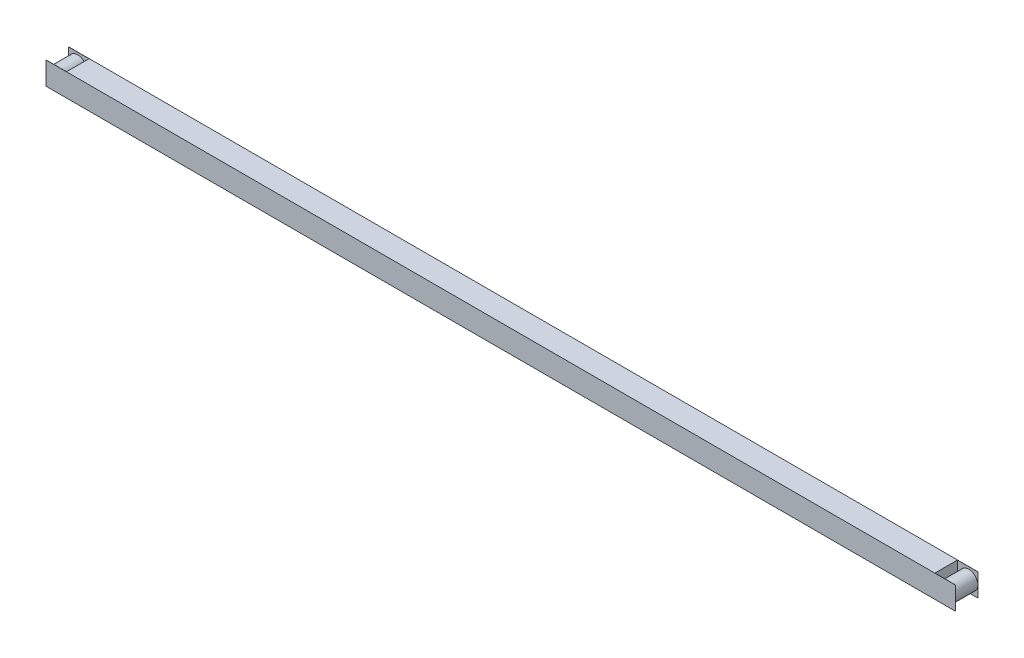
ISO-10303-21;
HEADER;
FILE_DESCRIPTION(('STEP AP214'),'2;1');
FILE_NAME('part.step','',(''),(''),'','','');
FILE_SCHEMA(('AUTOMOTIVE_DESIGN { 1 0 10303 214 1 1 1 1 }'));
ENDSEC;
DATA;
#1=APPLICATION_CONTEXT('core data for automotive mechanical design processes');
#2=APPLICATION_PROTOCOL_DEFINITION('international standard','automotive_design',2000,#1);
#3=PRODUCT_CONTEXT('',#1,'mechanical');
#4=PRODUCT('Part','Part','',(#3));
#5=PRODUCT_RELATED_PRODUCT_CATEGORY('part','',(#4));
#6=PRODUCT_DEFINITION_FORMATION('','',#4);
#7=PRODUCT_DEFINITION_CONTEXT('part definition',#1,'design');
#8=PRODUCT_DEFINITION('design','',#6,#7);
#9=PRODUCT_DEFINITION_SHAPE('','',#8);
#10=(LENGTH_UNIT() NAMED_UNIT(*) SI_UNIT(.MILLI.,.METRE.));
#11=(NAMED_UNIT(*) PLANE_ANGLE_UNIT() SI_UNIT($,.RADIAN.));
#12=(NAMED_UNIT(*) SI_UNIT($,.STERADIAN.) SOLID_ANGLE_UNIT());
#13=UNCERTAINTY_MEASURE_WITH_UNIT(LENGTH_MEASURE(1.E-05),#10,'distance_accuracy_value','');
#14=(GEOMETRIC_REPRESENTATION_CONTEXT(3) GLOBAL_UNCERTAINTY_ASSIGNED_CONTEXT((#13)) GLOBAL_UNIT_ASSIGNED_CONTEXT((#10,
#11,#12)) REPRESENTATION_CONTEXT('',''));
#15=CARTESIAN_POINT('',(0.,0.,0.));
#16=DIRECTION('',(0.,0.,1.));
#17=DIRECTION('',(1.,0.,0.));
#18=AXIS2_PLACEMENT_3D('',#15,#16,#17);
#19=CARTESIAN_POINT('',(0.,5.,5.));
#20=DIRECTION('',(1.,0.,0.));
#21=DIRECTION('',(0.,0.,-1.));
#22=AXIS2_PLACEMENT_3D('',#19,#20,#21);
#23=PLANE('',#22);
#24=DIRECTION('',(0.,-1.,0.));
#25=VECTOR('',#24,1.);
#26=CARTESIAN_POINT('',(0.,5.,0.0250000000000007));
#27=LINE('',#26,#25);
#28=CARTESIAN_POINT('',(0.,5.,0.0250000000000007));
#29=VERTEX_POINT('',#28);
#30=CARTESIAN_POINT('',(0.,2.5,0.0250000000000007));
#31=VERTEX_POINT('',#30);
#32=EDGE_CURVE('E269',#29,#31,#27,.T.);
#33=ORIENTED_EDGE('',*,*,#32,.F.);
#34=DIRECTION('',(0.,0.,-1.));
#35=VECTOR('',#34,1.);
#36=CARTESIAN_POINT('',(0.,5.,5.));
#37=LINE('',#36,#35);
#38=CARTESIAN_POINT('',(0.,5.,0.));
#39=VERTEX_POINT('',#38);
#40=EDGE_CURVE('E182',#29,#39,#37,.T.);
#41=ORIENTED_EDGE('',*,*,#40,.T.);
#42=DIRECTION('',(0.,-1.,0.));
#43=VECTOR('',#42,1.);
#44=CARTESIAN_POINT('',(0.,5.,0.));
#45=LINE('',#44,#43);
#46=CARTESIAN_POINT('',(0.,0.,0.));
#47=VERTEX_POINT('',#46);
#48=EDGE_CURVE('E183',#39,#47,#45,.T.);
#49=ORIENTED_EDGE('',*,*,#48,.T.);
#50=DIRECTION('',(0.,0.,-1.));
#51=VECTOR('',#50,1.);
#52=CARTESIAN_POINT('',(0.,0.,5.));
#53=LINE('',#52,#51);
#54=CARTESIAN_POINT('',(0.,0.,0.0250000000000007));
#55=VERTEX_POINT('',#54);
#56=EDGE_CURVE('E49',#55,#47,#53,.T.);
#57=ORIENTED_EDGE('',*,*,#56,.F.);
#58=EDGE_CURVE('E256',#31,#55,#27,.T.);
#59=ORIENTED_EDGE('',*,*,#58,.F.);
#60=EDGE_LOOP('',(#33,#41,#49,#57,#59));
#61=FACE_BOUND('',#60,.T.);
#62=ADVANCED_FACE('F41',(#61),#23,.F.);
#63=CARTESIAN_POINT('',(0.,0.,5.));
#64=DIRECTION('',(0.,1.,0.));
#65=DIRECTION('',(0.,0.,1.));
#66=AXIS2_PLACEMENT_3D('',#63,#64,#65);
#67=PLANE('',#66);
#68=DIRECTION('',(1.,0.,0.));
#69=VECTOR('',#68,1.);
#70=CARTESIAN_POINT('',(0.,0.,0.0250000000000007));
#71=LINE('',#70,#69);
#72=CARTESIAN_POINT('',(4.5,0.,0.0250000000000007));
#73=VERTEX_POINT('',#72);
#74=EDGE_CURVE('E267',#55,#73,#71,.T.);
#75=ORIENTED_EDGE('',*,*,#74,.F.);
#76=ORIENTED_EDGE('',*,*,#56,.T.);
#77=DIRECTION('',(1.,0.,0.));
#78=VECTOR('',#77,1.);
#79=CARTESIAN_POINT('',(0.,0.,0.));
#80=LINE('',#79,#78);
#81=CARTESIAN_POINT('',(200.,0.,0.));
#82=VERTEX_POINT('',#81);
#83=EDGE_CURVE('E186',#47,#82,#80,.T.);
#84=ORIENTED_EDGE('',*,*,#83,.T.);
#85=DIRECTION('',(0.,0.,-1.));
#86=VECTOR('',#85,1.);
#87=CARTESIAN_POINT('',(200.,0.,5.));
#88=LINE('',#87,#86);
#89=CARTESIAN_POINT('',(200.,0.,0.0250000000000007));
#90=VERTEX_POINT('',#89);
#91=EDGE_CURVE('E199',#90,#82,#88,.T.);
#92=ORIENTED_EDGE('',*,*,#91,.F.);
#93=DIRECTION('',(1.,0.,0.));
#94=VECTOR('',#93,1.);
#95=CARTESIAN_POINT('',(200.,0.,0.0250000000000007));
#96=LINE('',#95,#94);
#97=CARTESIAN_POINT('',(195.5,0.,0.0250000000000007));
#98=VERTEX_POINT('',#97);
#99=EDGE_CURVE('E147',#98,#90,#96,.T.);
#100=ORIENTED_EDGE('',*,*,#99,.F.);
#101=DIRECTION('',(0.,0.,1.));
#102=VECTOR('',#101,1.);
#103=CARTESIAN_POINT('',(195.5,0.,0.0250000000000007));
#104=LINE('',#103,#102);
#105=CARTESIAN_POINT('',(195.5,0.,4.975));
#106=VERTEX_POINT('',#105);
#107=EDGE_CURVE('E160',#98,#106,#104,.T.);
#108=ORIENTED_EDGE('',*,*,#107,.T.);
#109=DIRECTION('',(1.,0.,0.));
#110=VECTOR('',#109,1.);
#111=CARTESIAN_POINT('',(200.,0.,4.975));
#112=LINE('',#111,#110);
#113=CARTESIAN_POINT('',(200.,0.,4.975));
#114=VERTEX_POINT('',#113);
#115=EDGE_CURVE('E225',#106,#114,#112,.T.);
#116=ORIENTED_EDGE('',*,*,#115,.T.);
#117=CARTESIAN_POINT('',(200.,0.,5.));
#118=VERTEX_POINT('',#117);
#119=EDGE_CURVE('E200',#118,#114,#88,.T.);
#120=ORIENTED_EDGE('',*,*,#119,.F.);
#121=DIRECTION('',(1.,0.,0.));
#122=VECTOR('',#121,1.);
#123=CARTESIAN_POINT('',(0.,0.,5.));
#124=LINE('',#123,#122);
#125=CARTESIAN_POINT('',(0.,0.,5.));
#126=VERTEX_POINT('',#125);
#127=EDGE_CURVE('E175',#126,#118,#124,.T.);
#128=ORIENTED_EDGE('',*,*,#127,.F.);
#129=CARTESIAN_POINT('',(0.,0.,4.975));
#130=VERTEX_POINT('',#129);
#131=EDGE_CURVE('E11',#126,#130,#53,.T.);
#132=ORIENTED_EDGE('',*,*,#131,.T.);
#133=DIRECTION('',(1.,0.,0.));
#134=VECTOR('',#133,1.);
#135=CARTESIAN_POINT('',(0.,0.,4.975));
#136=LINE('',#135,#134);
#137=CARTESIAN_POINT('',(4.5,0.,4.975));
#138=VERTEX_POINT('',#137);
#139=EDGE_CURVE('E244',#130,#138,#136,.T.);
#140=ORIENTED_EDGE('',*,*,#139,.T.);
#141=DIRECTION('',(0.,0.,1.));
#142=VECTOR('',#141,1.);
#143=CARTESIAN_POINT('',(4.5,0.,0.0250000000000007));
#144=LINE('',#143,#142);
#145=EDGE_CURVE('E258',#73,#138,#144,.T.);
#146=ORIENTED_EDGE('',*,*,#145,.F.);
#147=EDGE_LOOP('',(#75,#76,#84,#92,#100,#108,#116,#120,#128,#132,#140,#146));
#148=FACE_BOUND('',#147,.T.);
#149=ADVANCED_FACE('F211',(#148),#67,.F.);
#150=CARTESIAN_POINT('',(200.,0.,5.));
#151=DIRECTION('',(-1.,0.,0.));
#152=DIRECTION('',(0.,0.,1.));
#153=AXIS2_PLACEMENT_3D('',#150,#151,#152);
#154=PLANE('',#153);
#155=DIRECTION('',(0.,1.,0.));
#156=VECTOR('',#155,1.);
#157=CARTESIAN_POINT('',(200.,5.,4.975));
#158=LINE('',#157,#156);
#159=CARTESIAN_POINT('',(200.,2.5,4.975));
#160=VERTEX_POINT('',#159);
#161=EDGE_CURVE('E233',#114,#160,#158,.T.);
#162=ORIENTED_EDGE('',*,*,#161,.T.);
#163=CARTESIAN_POINT('',(200.,5.,4.975));
#164=VERTEX_POINT('',#163);
#165=EDGE_CURVE('E171',#160,#164,#158,.T.);
#166=ORIENTED_EDGE('',*,*,#165,.T.);
#167=DIRECTION('',(0.,0.,-1.));
#168=VECTOR('',#167,1.);
#169=CARTESIAN_POINT('',(200.,5.,5.));
#170=LINE('',#169,#168);
#171=CARTESIAN_POINT('',(200.,5.,5.));
#172=VERTEX_POINT('',#171);
#173=EDGE_CURVE('E197',#172,#164,#170,.T.);
#174=ORIENTED_EDGE('',*,*,#173,.F.);
#175=DIRECTION('',(0.,1.,0.));
#176=VECTOR('',#175,1.);
#177=CARTESIAN_POINT('',(200.,0.,5.));
#178=LINE('',#177,#176);
#179=EDGE_CURVE('E178',#118,#172,#178,.T.);
#180=ORIENTED_EDGE('',*,*,#179,.F.);
#181=ORIENTED_EDGE('',*,*,#119,.T.);
#182=EDGE_LOOP('',(#162,#166,#174,#180,#181));
#183=FACE_BOUND('',#182,.T.);
#184=ADVANCED_FACE('F279',(#183),#154,.F.);
#185=CARTESIAN_POINT('',(200.,5.,5.));
#186=DIRECTION('',(0.,-1.,0.));
#187=DIRECTION('',(1.,0.,0.));
#188=AXIS2_PLACEMENT_3D('',#185,#186,#187);
#189=PLANE('',#188);
#190=DIRECTION('',(-1.,0.,0.));
#191=VECTOR('',#190,1.);
#192=CARTESIAN_POINT('',(0.,5.,0.0250000000000007));
#193=LINE('',#192,#191);
#194=CARTESIAN_POINT('',(4.5,5.,0.0250000000000007));
#195=VERTEX_POINT('',#194);
#196=EDGE_CURVE('E247',#195,#29,#193,.T.);
#197=ORIENTED_EDGE('',*,*,#196,.F.);
#198=DIRECTION('',(0.,0.,1.));
#199=VECTOR('',#198,1.);
#200=CARTESIAN_POINT('',(4.5,5.,0.0250000000000007));
#201=LINE('',#200,#199);
#202=CARTESIAN_POINT('',(4.5,5.,4.975));
#203=VERTEX_POINT('',#202);
#204=EDGE_CURVE('E187',#195,#203,#201,.T.);
#205=ORIENTED_EDGE('',*,*,#204,.T.);
#206=DIRECTION('',(-1.,0.,0.));
#207=VECTOR('',#206,1.);
#208=CARTESIAN_POINT('',(0.,5.,4.975));
#209=LINE('',#208,#207);
#210=CARTESIAN_POINT('',(0.,5.,4.975));
#211=VERTEX_POINT('',#210);
#212=EDGE_CURVE('E253',#203,#211,#209,.T.);
#213=ORIENTED_EDGE('',*,*,#212,.T.);
#214=CARTESIAN_POINT('',(0.,5.,5.));
#215=VERTEX_POINT('',#214);
#216=EDGE_CURVE('E194',#215,#211,#37,.T.);
#217=ORIENTED_EDGE('',*,*,#216,.F.);
#218=DIRECTION('',(-1.,0.,0.));
#219=VECTOR('',#218,1.);
#220=CARTESIAN_POINT('',(200.,5.,5.));
#221=LINE('',#220,#219);
#222=EDGE_CURVE('E180',#172,#215,#221,.T.);
#223=ORIENTED_EDGE('',*,*,#222,.F.);
#224=ORIENTED_EDGE('',*,*,#173,.T.);
#225=DIRECTION('',(-1.,0.,0.));
#226=VECTOR('',#225,1.);
#227=CARTESIAN_POINT('',(195.5,5.,4.975));
#228=LINE('',#227,#226);
#229=CARTESIAN_POINT('',(195.5,5.,4.975));
#230=VERTEX_POINT('',#229);
#231=EDGE_CURVE('E164',#164,#230,#228,.T.);
#232=ORIENTED_EDGE('',*,*,#231,.T.);
#233=DIRECTION('',(0.,0.,1.));
#234=VECTOR('',#233,1.);
#235=CARTESIAN_POINT('',(195.5,5.,0.0250000000000007));
#236=LINE('',#235,#234);
#237=CARTESIAN_POINT('',(195.5,5.,0.0250000000000007));
#238=VERTEX_POINT('',#237);
#239=EDGE_CURVE('E158',#238,#230,#236,.T.);
#240=ORIENTED_EDGE('',*,*,#239,.F.);
#241=DIRECTION('',(-1.,0.,0.));
#242=VECTOR('',#241,1.);
#243=CARTESIAN_POINT('',(195.5,5.,0.0250000000000007));
#244=LINE('',#243,#242);
#245=CARTESIAN_POINT('',(200.,5.,0.0250000000000007));
#246=VERTEX_POINT('',#245);
#247=EDGE_CURVE('E169',#246,#238,#244,.T.);
#248=ORIENTED_EDGE('',*,*,#247,.F.);
#249=CARTESIAN_POINT('',(200.,5.,0.));
#250=VERTEX_POINT('',#249);
#251=EDGE_CURVE('E155',#246,#250,#170,.T.);
#252=ORIENTED_EDGE('',*,*,#251,.T.);
#253=DIRECTION('',(-1.,0.,0.));
#254=VECTOR('',#253,1.);
#255=CARTESIAN_POINT('',(200.,5.,0.));
#256=LINE('',#255,#254);
#257=EDGE_CURVE('E176',#250,#39,#256,.T.);
#258=ORIENTED_EDGE('',*,*,#257,.T.);
#259=ORIENTED_EDGE('',*,*,#40,.F.);
#260=EDGE_LOOP('',(#197,#205,#213,#217,#223,#224,#232,#240,#248,#252,#258,#259));
#261=FACE_BOUND('',#260,.T.);
#262=ADVANCED_FACE('F219',(#261),#189,.F.);
#263=ORIENTED_EDGE('',*,*,#216,.T.);
#264=DIRECTION('',(0.,-1.,0.));
#265=VECTOR('',#264,1.);
#266=CARTESIAN_POINT('',(0.,5.,4.975));
#267=LINE('',#266,#265);
#268=CARTESIAN_POINT('',(0.,2.5,4.975));
#269=VERTEX_POINT('',#268);
#270=EDGE_CURVE('E238',#211,#269,#267,.T.);
#271=ORIENTED_EDGE('',*,*,#270,.T.);
#272=EDGE_CURVE('E236',#269,#130,#267,.T.);
#273=ORIENTED_EDGE('',*,*,#272,.T.);
#274=ORIENTED_EDGE('',*,*,#131,.F.);
#275=DIRECTION('',(0.,-1.,0.));
#276=VECTOR('',#275,1.);
#277=CARTESIAN_POINT('',(0.,5.,5.));
#278=LINE('',#277,#276);
#279=EDGE_CURVE('E172',#215,#126,#278,.T.);
#280=ORIENTED_EDGE('',*,*,#279,.F.);
#281=EDGE_LOOP('',(#263,#271,#273,#274,#280));
#282=FACE_BOUND('',#281,.T.);
#283=ADVANCED_FACE('F43',(#282),#23,.F.);
#284=ORIENTED_EDGE('',*,*,#251,.F.);
#285=DIRECTION('',(0.,1.,0.));
#286=VECTOR('',#285,1.);
#287=CARTESIAN_POINT('',(200.,5.,0.0250000000000007));
#288=LINE('',#287,#286);
#289=CARTESIAN_POINT('',(200.,2.5,0.0250000000000007));
#290=VERTEX_POINT('',#289);
#291=EDGE_CURVE('E150',#290,#246,#288,.T.);
#292=ORIENTED_EDGE('',*,*,#291,.F.);
#293=EDGE_CURVE('E140',#90,#290,#288,.T.);
#294=ORIENTED_EDGE('',*,*,#293,.F.);
#295=ORIENTED_EDGE('',*,*,#91,.T.);
#296=DIRECTION('',(0.,1.,0.));
#297=VECTOR('',#296,1.);
#298=CARTESIAN_POINT('',(200.,0.,0.));
#299=LINE('',#298,#297);
#300=EDGE_CURVE('E190',#82,#250,#299,.T.);
#301=ORIENTED_EDGE('',*,*,#300,.T.);
#302=EDGE_LOOP('',(#284,#292,#294,#295,#301));
#303=FACE_BOUND('',#302,.T.);
#304=ADVANCED_FACE('F153',(#303),#154,.F.);
#305=CARTESIAN_POINT('',(0.,0.,5.));
#306=DIRECTION('',(0.,0.,1.));
#307=DIRECTION('',(1.,0.,0.));
#308=AXIS2_PLACEMENT_3D('',#305,#306,#307);
#309=PLANE('',#308);
#310=ORIENTED_EDGE('',*,*,#279,.T.);
#311=ORIENTED_EDGE('',*,*,#127,.T.);
#312=ORIENTED_EDGE('',*,*,#179,.T.);
#313=ORIENTED_EDGE('',*,*,#222,.T.);
#314=EDGE_LOOP('',(#310,#311,#312,#313));
#315=FACE_BOUND('',#314,.T.);
#316=ADVANCED_FACE('F289',(#315),#309,.T.);
#317=CARTESIAN_POINT('',(0.,0.,0.));
#318=DIRECTION('',(0.,0.,1.));
#319=DIRECTION('',(1.,0.,0.));
#320=AXIS2_PLACEMENT_3D('',#317,#318,#319);
#321=PLANE('',#320);
#322=ORIENTED_EDGE('',*,*,#48,.F.);
#323=ORIENTED_EDGE('',*,*,#257,.F.);
#324=ORIENTED_EDGE('',*,*,#300,.F.);
#325=ORIENTED_EDGE('',*,*,#83,.F.);
#326=EDGE_LOOP('',(#322,#323,#324,#325));
#327=FACE_BOUND('',#326,.T.);
#328=ADVANCED_FACE('F215',(#327),#321,.F.);
#329=CARTESIAN_POINT('',(195.5,0.,0.0250000000000007));
#330=DIRECTION('',(-1.,0.,0.));
#331=DIRECTION('',(0.,0.,1.));
#332=AXIS2_PLACEMENT_3D('',#329,#330,#331);
#333=PLANE('',#332);
#334=DIRECTION('',(0.,-1.,0.));
#335=VECTOR('',#334,1.);
#336=CARTESIAN_POINT('',(195.5,0.,4.975));
#337=LINE('',#336,#335);
#338=EDGE_CURVE('E235',#230,#106,#337,.T.);
#339=ORIENTED_EDGE('',*,*,#338,.T.);
#340=ORIENTED_EDGE('',*,*,#107,.F.);
#341=DIRECTION('',(0.,-1.,0.));
#342=VECTOR('',#341,1.);
#343=CARTESIAN_POINT('',(195.5,0.,0.0250000000000007));
#344=LINE('',#343,#342);
#345=EDGE_CURVE('E167',#238,#98,#344,.T.);
#346=ORIENTED_EDGE('',*,*,#345,.F.);
#347=ORIENTED_EDGE('',*,*,#239,.T.);
#348=EDGE_LOOP('',(#339,#340,#346,#347));
#349=FACE_BOUND('',#348,.T.);
#350=ADVANCED_FACE('F321',(#349),#333,.F.);
#351=CARTESIAN_POINT('',(0.,0.,0.0250000000000007));
#352=DIRECTION('',(0.,0.,-1.));
#353=DIRECTION('',(-1.,0.,0.));
#354=AXIS2_PLACEMENT_3D('',#351,#352,#353);
#355=PLANE('',#354);
#356=ORIENTED_EDGE('',*,*,#293,.T.);
#357=CARTESIAN_POINT('',(198.,2.5,0.0250000000000007));
#358=DIRECTION('',(0.,0.,1.));
#359=DIRECTION('',(1.,0.,0.));
#360=AXIS2_PLACEMENT_3D('',#357,#358,#359);
#361=CIRCLE('',#360,2.);
#362=EDGE_CURVE('E144',#290,#290,#361,.T.);
#363=ORIENTED_EDGE('',*,*,#362,.F.);
#364=ORIENTED_EDGE('',*,*,#291,.T.);
#365=ORIENTED_EDGE('',*,*,#247,.T.);
#366=ORIENTED_EDGE('',*,*,#345,.T.);
#367=ORIENTED_EDGE('',*,*,#99,.T.);
#368=EDGE_LOOP('',(#356,#363,#364,#365,#366,#367));
#369=FACE_BOUND('',#368,.T.);
#370=ADVANCED_FACE('F142',(#369),#355,.F.);
#371=CARTESIAN_POINT('',(0.,0.,4.975));
#372=DIRECTION('',(0.,0.,-1.));
#373=DIRECTION('',(-1.,0.,0.));
#374=AXIS2_PLACEMENT_3D('',#371,#372,#373);
#375=PLANE('',#374);
#376=ORIENTED_EDGE('',*,*,#165,.F.);
#377=CARTESIAN_POINT('',(198.,2.5,4.975));
#378=DIRECTION('',(0.,0.,1.));
#379=DIRECTION('',(1.,0.,0.));
#380=AXIS2_PLACEMENT_3D('',#377,#378,#379);
#381=CIRCLE('',#380,2.);
#382=EDGE_CURVE('E54',#160,#160,#381,.T.);
#383=ORIENTED_EDGE('',*,*,#382,.T.);
#384=ORIENTED_EDGE('',*,*,#161,.F.);
#385=ORIENTED_EDGE('',*,*,#115,.F.);
#386=ORIENTED_EDGE('',*,*,#338,.F.);
#387=ORIENTED_EDGE('',*,*,#231,.F.);
#388=EDGE_LOOP('',(#376,#383,#384,#385,#386,#387));
#389=FACE_BOUND('',#388,.T.);
#390=ADVANCED_FACE('F277',(#389),#375,.T.);
#391=CARTESIAN_POINT('',(4.5,5.,0.0250000000000007));
#392=DIRECTION('',(1.,0.,0.));
#393=DIRECTION('',(0.,1.,0.));
#394=AXIS2_PLACEMENT_3D('',#391,#392,#393);
#395=PLANE('',#394);
#396=DIRECTION('',(0.,1.,0.));
#397=VECTOR('',#396,1.);
#398=CARTESIAN_POINT('',(4.5,5.,4.975));
#399=LINE('',#398,#397);
#400=EDGE_CURVE('E251',#138,#203,#399,.T.);
#401=ORIENTED_EDGE('',*,*,#400,.T.);
#402=ORIENTED_EDGE('',*,*,#204,.F.);
#403=DIRECTION('',(0.,1.,0.));
#404=VECTOR('',#403,1.);
#405=CARTESIAN_POINT('',(4.5,5.,0.0250000000000007));
#406=LINE('',#405,#404);
#407=EDGE_CURVE('E262',#73,#195,#406,.T.);
#408=ORIENTED_EDGE('',*,*,#407,.F.);
#409=ORIENTED_EDGE('',*,*,#145,.T.);
#410=EDGE_LOOP('',(#401,#402,#408,#409));
#411=FACE_BOUND('',#410,.T.);
#412=ADVANCED_FACE('F318',(#411),#395,.F.);
#413=CARTESIAN_POINT('',(0.,0.,0.0250000000000007));
#414=DIRECTION('',(0.,0.,1.));
#415=DIRECTION('',(1.,0.,0.));
#416=AXIS2_PLACEMENT_3D('',#413,#414,#415);
#417=PLANE('',#416);
#418=ORIENTED_EDGE('',*,*,#32,.T.);
#419=CARTESIAN_POINT('',(2.,2.5,0.0250000000000007));
#420=DIRECTION('',(0.,0.,1.));
#421=DIRECTION('',(1.,0.,0.));
#422=AXIS2_PLACEMENT_3D('',#419,#420,#421);
#423=CIRCLE('',#422,2.);
#424=EDGE_CURVE('E59',#31,#31,#423,.T.);
#425=ORIENTED_EDGE('',*,*,#424,.F.);
#426=ORIENTED_EDGE('',*,*,#58,.T.);
#427=ORIENTED_EDGE('',*,*,#74,.T.);
#428=ORIENTED_EDGE('',*,*,#407,.T.);
#429=ORIENTED_EDGE('',*,*,#196,.T.);
#430=EDGE_LOOP('',(#418,#425,#426,#427,#428,#429));
#431=FACE_BOUND('',#430,.T.);
#432=ADVANCED_FACE('F315',(#431),#417,.T.);
#433=CARTESIAN_POINT('',(0.,0.,4.975));
#434=DIRECTION('',(0.,0.,1.));
#435=DIRECTION('',(1.,0.,0.));
#436=AXIS2_PLACEMENT_3D('',#433,#434,#435);
#437=PLANE('',#436);
#438=ORIENTED_EDGE('',*,*,#272,.F.);
#439=CARTESIAN_POINT('',(2.,2.5,4.975));
#440=DIRECTION('',(0.,0.,1.));
#441=DIRECTION('',(1.,0.,0.));
#442=AXIS2_PLACEMENT_3D('',#439,#440,#441);
#443=CIRCLE('',#442,2.);
#444=EDGE_CURVE('E227',#269,#269,#443,.T.);
#445=ORIENTED_EDGE('',*,*,#444,.T.);
#446=ORIENTED_EDGE('',*,*,#270,.F.);
#447=ORIENTED_EDGE('',*,*,#212,.F.);
#448=ORIENTED_EDGE('',*,*,#400,.F.);
#449=ORIENTED_EDGE('',*,*,#139,.F.);
#450=EDGE_LOOP('',(#438,#445,#446,#447,#448,#449));
#451=FACE_BOUND('',#450,.T.);
#452=ADVANCED_FACE('F304',(#451),#437,.F.);
#453=CARTESIAN_POINT('',(2.,2.5,4.975));
#454=DIRECTION('',(0.,0.,-1.));
#455=DIRECTION('',(-1.,0.,0.));
#456=AXIS2_PLACEMENT_3D('',#453,#454,#455);
#457=CYLINDRICAL_SURFACE('',#456,2.);
#458=ORIENTED_EDGE('',*,*,#444,.F.);
#459=EDGE_LOOP('',(#458));
#460=FACE_BOUND('',#459,.T.);
#461=ORIENTED_EDGE('',*,*,#424,.T.);
#462=EDGE_LOOP('',(#461));
#463=FACE_BOUND('',#462,.T.);
#464=ADVANCED_FACE('F307',(#460,#463),#457,.T.);
#465=CARTESIAN_POINT('',(198.,2.5,4.975));
#466=DIRECTION('',(0.,0.,-1.));
#467=DIRECTION('',(-1.,0.,0.));
#468=AXIS2_PLACEMENT_3D('',#465,#466,#467);
#469=CYLINDRICAL_SURFACE('',#468,2.);
#470=ORIENTED_EDGE('',*,*,#382,.F.);
#471=EDGE_LOOP('',(#470));
#472=FACE_BOUND('',#471,.T.);
#473=ORIENTED_EDGE('',*,*,#362,.T.);
#474=EDGE_LOOP('',(#473));
#475=FACE_BOUND('',#474,.T.);
#476=ADVANCED_FACE('F308',(#472,#475),#469,.T.);
#477=CLOSED_SHELL('',(#62,#149,#184,#262,#283,#304,#316,#328,#350,#370,#390,#412,#432,#452,#464,#476));
#478=MANIFOLD_SOLID_BREP('B2',#477);
#479=ADVANCED_BREP_SHAPE_REPRESENTATION('',(#18,#478),#14);
#480=SHAPE_DEFINITION_REPRESENTATION(#9,#479);
ENDSEC;
END-ISO-10303-21;
